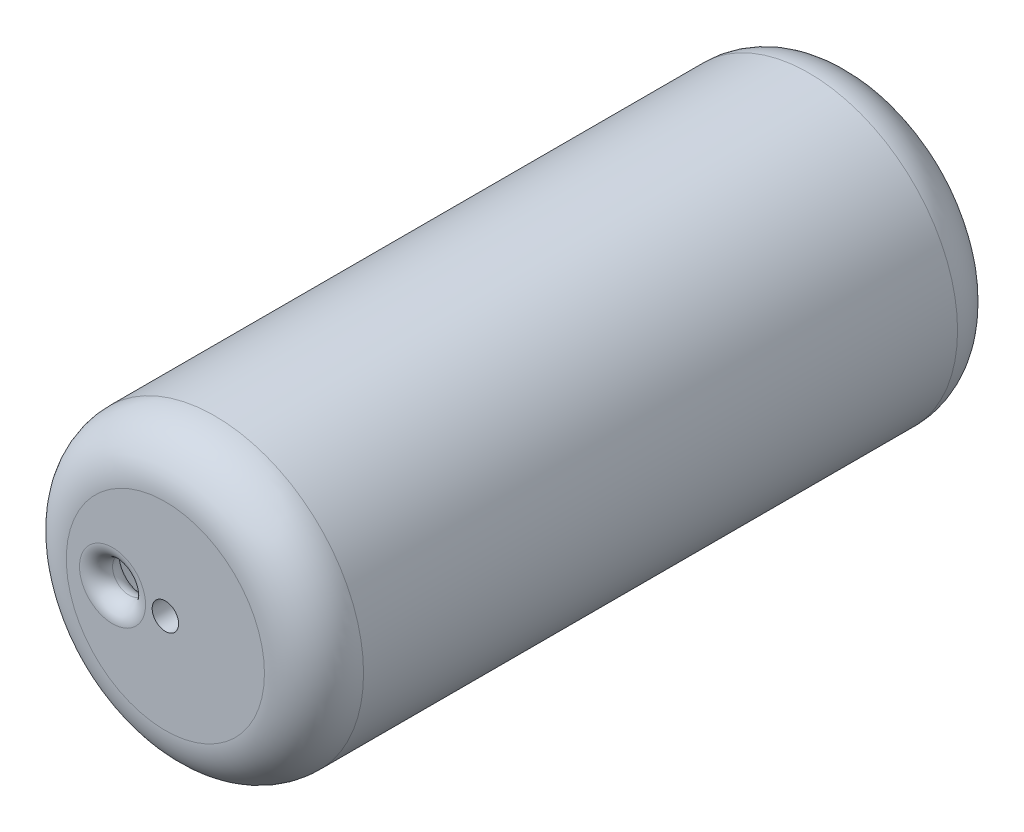
ISO-10303-21;
HEADER;
FILE_DESCRIPTION(('STEP AP214'),'2;1');
FILE_NAME('part.step','',(''),(''),'','','');
FILE_SCHEMA(('AUTOMOTIVE_DESIGN { 1 0 10303 214 1 1 1 1 }'));
ENDSEC;
DATA;
#1=APPLICATION_CONTEXT('core data for automotive mechanical design processes');
#2=APPLICATION_PROTOCOL_DEFINITION('international standard','automotive_design',2000,#1);
#3=PRODUCT_CONTEXT('',#1,'mechanical');
#4=PRODUCT('Part','Part','',(#3));
#5=PRODUCT_RELATED_PRODUCT_CATEGORY('part','',(#4));
#6=PRODUCT_DEFINITION_FORMATION('','',#4);
#7=PRODUCT_DEFINITION_CONTEXT('part definition',#1,'design');
#8=PRODUCT_DEFINITION('design','',#6,#7);
#9=PRODUCT_DEFINITION_SHAPE('','',#8);
#10=(LENGTH_UNIT() NAMED_UNIT(*) SI_UNIT(.MILLI.,.METRE.));
#11=(NAMED_UNIT(*) PLANE_ANGLE_UNIT() SI_UNIT($,.RADIAN.));
#12=(NAMED_UNIT(*) SI_UNIT($,.STERADIAN.) SOLID_ANGLE_UNIT());
#13=UNCERTAINTY_MEASURE_WITH_UNIT(LENGTH_MEASURE(1.E-05),#10,'distance_accuracy_value','');
#14=(GEOMETRIC_REPRESENTATION_CONTEXT(3) GLOBAL_UNCERTAINTY_ASSIGNED_CONTEXT((#13)) GLOBAL_UNIT_ASSIGNED_CONTEXT((#10,
#11,#12)) REPRESENTATION_CONTEXT('',''));
#15=CARTESIAN_POINT('',(0.,0.,0.));
#16=DIRECTION('',(0.,0.,1.));
#17=DIRECTION('',(1.,0.,0.));
#18=AXIS2_PLACEMENT_3D('',#15,#16,#17);
#19=CARTESIAN_POINT('',(0.,0.,3.175));
#20=DIRECTION('',(0.,0.,1.));
#21=DIRECTION('',(1.,0.,0.));
#22=AXIS2_PLACEMENT_3D('',#19,#20,#21);
#23=PLANE('',#22);
#24=CARTESIAN_POINT('',(-5.08,0.,3.175));
#25=DIRECTION('',(0.,0.,1.));
#26=DIRECTION('',(1.,0.,0.));
#27=AXIS2_PLACEMENT_3D('',#24,#25,#26);
#28=CIRCLE('',#27,3.175);
#29=CARTESIAN_POINT('',(-1.905,0.,3.175));
#30=VERTEX_POINT('',#29);
#31=EDGE_CURVE('E10',#30,#30,#28,.F.);
#32=ORIENTED_EDGE('',*,*,#31,.T.);
#33=EDGE_LOOP('',(#32));
#34=FACE_BOUND('',#33,.T.);
#35=CARTESIAN_POINT('',(0.,0.,3.175));
#36=DIRECTION('',(0.,0.,1.));
#37=DIRECTION('',(1.,0.,0.));
#38=AXIS2_PLACEMENT_3D('',#35,#36,#37);
#39=CIRCLE('',#38,1.27);
#40=CARTESIAN_POINT('',(1.27,0.,3.175));
#41=VERTEX_POINT('',#40);
#42=EDGE_CURVE('E129',#41,#41,#39,.T.);
#43=ORIENTED_EDGE('',*,*,#42,.F.);
#44=EDGE_LOOP('',(#43));
#45=FACE_BOUND('',#44,.T.);
#46=CARTESIAN_POINT('',(0.,0.,3.175));
#47=DIRECTION('',(0.,0.,1.));
#48=DIRECTION('',(1.,0.,0.));
#49=AXIS2_PLACEMENT_3D('',#46,#47,#48);
#50=CIRCLE('',#49,11.7475);
#51=CARTESIAN_POINT('',(11.7475,0.,3.175));
#52=VERTEX_POINT('',#51);
#53=EDGE_CURVE('E125',#52,#52,#50,.F.);
#54=ORIENTED_EDGE('',*,*,#53,.F.);
#55=EDGE_LOOP('',(#54));
#56=FACE_BOUND('',#55,.T.);
#57=ADVANCED_FACE('F31',(#34,#45,#56),#23,.T.);
#58=CARTESIAN_POINT('',(0.,0.,63.4492));
#59=DIRECTION('',(0.,0.,-1.));
#60=DIRECTION('',(-1.,0.,0.));
#61=AXIS2_PLACEMENT_3D('',#58,#59,#60);
#62=CYLINDRICAL_SURFACE('',#61,11.7475);
#63=CARTESIAN_POINT('',(0.,0.,63.4492));
#64=DIRECTION('',(0.,0.,1.));
#65=DIRECTION('',(1.,0.,0.));
#66=AXIS2_PLACEMENT_3D('',#63,#64,#65);
#67=CIRCLE('',#66,11.7475);
#68=CARTESIAN_POINT('',(11.7475,0.,63.4492));
#69=VERTEX_POINT('',#68);
#70=EDGE_CURVE('E132',#69,#69,#67,.T.);
#71=ORIENTED_EDGE('',*,*,#70,.T.);
#72=EDGE_LOOP('',(#71));
#73=FACE_BOUND('',#72,.T.);
#74=ORIENTED_EDGE('',*,*,#53,.T.);
#75=EDGE_LOOP('',(#74));
#76=FACE_BOUND('',#75,.T.);
#77=ADVANCED_FACE('F72',(#73,#76),#62,.F.);
#78=CARTESIAN_POINT('',(0.,0.,63.4492));
#79=DIRECTION('',(0.,0.,1.));
#80=DIRECTION('',(1.,0.,0.));
#81=AXIS2_PLACEMENT_3D('',#78,#79,#80);
#82=PLANE('',#81);
#83=CARTESIAN_POINT('',(-5.08,0.,63.4492));
#84=DIRECTION('',(0.,0.,1.));
#85=DIRECTION('',(1.,0.,0.));
#86=AXIS2_PLACEMENT_3D('',#83,#84,#85);
#87=CIRCLE('',#86,3.175);
#88=CARTESIAN_POINT('',(-1.905,0.,63.4492));
#89=VERTEX_POINT('',#88);
#90=EDGE_CURVE('E44',#89,#89,#87,.T.);
#91=ORIENTED_EDGE('',*,*,#90,.T.);
#92=EDGE_LOOP('',(#91));
#93=FACE_BOUND('',#92,.T.);
#94=CARTESIAN_POINT('',(0.,0.,63.4492));
#95=DIRECTION('',(0.,0.,1.));
#96=DIRECTION('',(1.,0.,0.));
#97=AXIS2_PLACEMENT_3D('',#94,#95,#96);
#98=CIRCLE('',#97,1.27);
#99=CARTESIAN_POINT('',(1.27,0.,63.4492));
#100=VERTEX_POINT('',#99);
#101=EDGE_CURVE('E126',#100,#100,#98,.T.);
#102=ORIENTED_EDGE('',*,*,#101,.T.);
#103=EDGE_LOOP('',(#102));
#104=FACE_BOUND('',#103,.T.);
#105=ORIENTED_EDGE('',*,*,#70,.F.);
#106=EDGE_LOOP('',(#105));
#107=FACE_BOUND('',#106,.T.);
#108=ADVANCED_FACE('F77',(#93,#104,#107),#82,.F.);
#109=CARTESIAN_POINT('',(0.,0.,0.));
#110=DIRECTION('',(0.,0.,1.));
#111=DIRECTION('',(1.,0.,0.));
#112=AXIS2_PLACEMENT_3D('',#109,#110,#111);
#113=CYLINDRICAL_SURFACE('',#112,1.27);
#114=CARTESIAN_POINT('',(0.,0.,66.6242));
#115=DIRECTION('',(0.,0.,1.));
#116=DIRECTION('',(1.,0.,0.));
#117=AXIS2_PLACEMENT_3D('',#114,#115,#116);
#118=CIRCLE('',#117,1.27);
#119=CARTESIAN_POINT('',(1.27,0.,66.6242));
#120=VERTEX_POINT('',#119);
#121=EDGE_CURVE('E49',#120,#120,#118,.T.);
#122=ORIENTED_EDGE('',*,*,#121,.T.);
#123=EDGE_LOOP('',(#122));
#124=FACE_BOUND('',#123,.T.);
#125=ORIENTED_EDGE('',*,*,#101,.F.);
#126=EDGE_LOOP('',(#125));
#127=FACE_BOUND('',#126,.T.);
#128=ADVANCED_FACE('F142',(#124,#127),#113,.F.);
#129=ORIENTED_EDGE('',*,*,#42,.T.);
#130=EDGE_LOOP('',(#129));
#131=FACE_BOUND('',#130,.T.);
#132=CARTESIAN_POINT('',(0.,0.,0.));
#133=DIRECTION('',(0.,0.,1.));
#134=DIRECTION('',(1.,0.,0.));
#135=AXIS2_PLACEMENT_3D('',#132,#133,#134);
#136=CIRCLE('',#135,1.27);
#137=CARTESIAN_POINT('',(1.27,0.,0.));
#138=VERTEX_POINT('',#137);
#139=EDGE_CURVE('E53',#138,#138,#136,.T.);
#140=ORIENTED_EDGE('',*,*,#139,.F.);
#141=EDGE_LOOP('',(#140));
#142=FACE_BOUND('',#141,.T.);
#143=ADVANCED_FACE('F91',(#131,#142),#113,.F.);
#144=CARTESIAN_POINT('',(0.,0.,3.175));
#145=DIRECTION('',(0.,0.,-1.));
#146=DIRECTION('',(-1.,0.,0.));
#147=AXIS2_PLACEMENT_3D('',#144,#145,#146);
#148=CYLINDRICAL_SURFACE('',#147,14.2875);
#149=CARTESIAN_POINT('',(0.,0.,4.7625));
#150=DIRECTION('',(0.,0.,1.));
#151=DIRECTION('',(1.,0.,0.));
#152=AXIS2_PLACEMENT_3D('',#149,#150,#151);
#153=CIRCLE('',#152,14.2875);
#154=CARTESIAN_POINT('',(14.2875,0.,4.7625));
#155=VERTEX_POINT('',#154);
#156=EDGE_CURVE('E119',#155,#155,#153,.T.);
#157=ORIENTED_EDGE('',*,*,#156,.T.);
#158=EDGE_LOOP('',(#157));
#159=FACE_BOUND('',#158,.T.);
#160=CARTESIAN_POINT('',(0.,0.,61.8617));
#161=DIRECTION('',(0.,0.,1.));
#162=DIRECTION('',(1.,0.,0.));
#163=AXIS2_PLACEMENT_3D('',#160,#161,#162);
#164=CIRCLE('',#163,14.2875);
#165=CARTESIAN_POINT('',(14.2875,0.,61.8617));
#166=VERTEX_POINT('',#165);
#167=EDGE_CURVE('E122',#166,#166,#164,.F.);
#168=ORIENTED_EDGE('',*,*,#167,.T.);
#169=EDGE_LOOP('',(#168));
#170=FACE_BOUND('',#169,.T.);
#171=ADVANCED_FACE('F87',(#159,#170),#148,.T.);
#172=CARTESIAN_POINT('',(0.,0.,0.));
#173=DIRECTION('',(0.,0.,1.));
#174=DIRECTION('',(1.,0.,0.));
#175=AXIS2_PLACEMENT_3D('',#172,#173,#174);
#176=PLANE('',#175);
#177=CARTESIAN_POINT('',(-5.08,0.,0.));
#178=DIRECTION('',(0.,0.,1.));
#179=DIRECTION('',(1.,0.,0.));
#180=AXIS2_PLACEMENT_3D('',#177,#178,#179);
#181=CIRCLE('',#180,3.175);
#182=CARTESIAN_POINT('',(-1.905,0.,0.));
#183=VERTEX_POINT('',#182);
#184=EDGE_CURVE('E39',#183,#183,#181,.T.);
#185=ORIENTED_EDGE('',*,*,#184,.T.);
#186=EDGE_LOOP('',(#185));
#187=FACE_BOUND('',#186,.T.);
#188=CARTESIAN_POINT('',(0.,0.,0.));
#189=DIRECTION('',(0.,0.,1.));
#190=DIRECTION('',(1.,0.,0.));
#191=AXIS2_PLACEMENT_3D('',#188,#189,#190);
#192=CIRCLE('',#191,9.525);
#193=CARTESIAN_POINT('',(9.525,0.,0.));
#194=VERTEX_POINT('',#193);
#195=EDGE_CURVE('E116',#194,#194,#192,.F.);
#196=ORIENTED_EDGE('',*,*,#195,.T.);
#197=EDGE_LOOP('',(#196));
#198=FACE_BOUND('',#197,.T.);
#199=ORIENTED_EDGE('',*,*,#139,.T.);
#200=EDGE_LOOP('',(#199));
#201=FACE_BOUND('',#200,.T.);
#202=ADVANCED_FACE('F83',(#187,#198,#201),#176,.F.);
#203=CARTESIAN_POINT('',(0.,0.,66.6242));
#204=DIRECTION('',(0.,0.,1.));
#205=DIRECTION('',(1.,0.,0.));
#206=AXIS2_PLACEMENT_3D('',#203,#204,#205);
#207=PLANE('',#206);
#208=CARTESIAN_POINT('',(-5.08,0.,66.6242));
#209=DIRECTION('',(0.,0.,1.));
#210=DIRECTION('',(1.,0.,0.));
#211=AXIS2_PLACEMENT_3D('',#208,#209,#210);
#212=CIRCLE('',#211,3.175);
#213=CARTESIAN_POINT('',(-1.905,0.,66.6242));
#214=VERTEX_POINT('',#213);
#215=EDGE_CURVE('E109',#214,#214,#212,.F.);
#216=ORIENTED_EDGE('',*,*,#215,.T.);
#217=EDGE_LOOP('',(#216));
#218=FACE_BOUND('',#217,.T.);
#219=CARTESIAN_POINT('',(0.,0.,66.6242));
#220=DIRECTION('',(0.,0.,1.));
#221=DIRECTION('',(1.,0.,0.));
#222=AXIS2_PLACEMENT_3D('',#219,#220,#221);
#223=CIRCLE('',#222,9.525);
#224=CARTESIAN_POINT('',(9.525,0.,66.6242));
#225=VERTEX_POINT('',#224);
#226=EDGE_CURVE('E111',#225,#225,#223,.T.);
#227=ORIENTED_EDGE('',*,*,#226,.T.);
#228=EDGE_LOOP('',(#227));
#229=FACE_BOUND('',#228,.T.);
#230=ORIENTED_EDGE('',*,*,#121,.F.);
#231=EDGE_LOOP('',(#230));
#232=FACE_BOUND('',#231,.T.);
#233=ADVANCED_FACE('F86',(#218,#229,#232),#207,.T.);
#234=CARTESIAN_POINT('',(0.,0.,4.7625));
#235=DIRECTION('',(0.,0.,1.));
#236=DIRECTION('',(1.,0.,0.));
#237=AXIS2_PLACEMENT_3D('',#234,#235,#236);
#238=TOROIDAL_SURFACE('',#237,9.525,4.7625);
#239=ORIENTED_EDGE('',*,*,#195,.F.);
#240=EDGE_LOOP('',(#239));
#241=FACE_BOUND('',#240,.T.);
#242=ORIENTED_EDGE('',*,*,#156,.F.);
#243=EDGE_LOOP('',(#242));
#244=FACE_BOUND('',#243,.T.);
#245=ADVANCED_FACE('F93',(#241,#244),#238,.T.);
#246=CARTESIAN_POINT('',(0.,0.,61.8617));
#247=DIRECTION('',(0.,0.,1.));
#248=DIRECTION('',(1.,0.,0.));
#249=AXIS2_PLACEMENT_3D('',#246,#247,#248);
#250=TOROIDAL_SURFACE('',#249,9.525,4.7625);
#251=ORIENTED_EDGE('',*,*,#167,.F.);
#252=EDGE_LOOP('',(#251));
#253=FACE_BOUND('',#252,.T.);
#254=ORIENTED_EDGE('',*,*,#226,.F.);
#255=EDGE_LOOP('',(#254));
#256=FACE_BOUND('',#255,.T.);
#257=ADVANCED_FACE('F96',(#253,#256),#250,.T.);
#258=CARTESIAN_POINT('',(-5.08,0.,65.0367));
#259=DIRECTION('',(0.,0.,1.));
#260=DIRECTION('',(1.,0.,0.));
#261=AXIS2_PLACEMENT_3D('',#258,#259,#260);
#262=TOROIDAL_SURFACE('',#261,3.175,1.5875);
#263=ORIENTED_EDGE('',*,*,#90,.F.);
#264=EDGE_LOOP('',(#263));
#265=FACE_BOUND('',#264,.T.);
#266=CARTESIAN_POINT('',(-5.08,0.,65.0367));
#267=DIRECTION('',(0.,0.,1.));
#268=DIRECTION('',(1.,0.,0.));
#269=AXIS2_PLACEMENT_3D('',#266,#267,#268);
#270=CIRCLE('',#269,1.5875);
#271=CARTESIAN_POINT('',(-3.4925,0.,65.0367));
#272=VERTEX_POINT('',#271);
#273=EDGE_CURVE('E47',#272,#272,#270,.F.);
#274=ORIENTED_EDGE('',*,*,#273,.F.);
#275=EDGE_LOOP('',(#274));
#276=FACE_BOUND('',#275,.T.);
#277=ADVANCED_FACE('F68',(#265,#276),#262,.T.);
#278=CARTESIAN_POINT('',(-5.08,0.,65.0367));
#279=DIRECTION('',(0.,0.,1.));
#280=DIRECTION('',(1.,0.,0.));
#281=AXIS2_PLACEMENT_3D('',#278,#279,#280);
#282=TOROIDAL_SURFACE('',#281,3.175,1.5875);
#283=ORIENTED_EDGE('',*,*,#215,.F.);
#284=EDGE_LOOP('',(#283));
#285=FACE_BOUND('',#284,.T.);
#286=ORIENTED_EDGE('',*,*,#273,.T.);
#287=EDGE_LOOP('',(#286));
#288=FACE_BOUND('',#287,.T.);
#289=ADVANCED_FACE('F62',(#285,#288),#282,.T.);
#290=CARTESIAN_POINT('',(-5.08,0.,1.5875));
#291=DIRECTION('',(0.,0.,1.));
#292=DIRECTION('',(1.,0.,0.));
#293=AXIS2_PLACEMENT_3D('',#290,#291,#292);
#294=TOROIDAL_SURFACE('',#293,3.175,1.5875);
#295=ORIENTED_EDGE('',*,*,#31,.F.);
#296=EDGE_LOOP('',(#295));
#297=FACE_BOUND('',#296,.T.);
#298=CARTESIAN_POINT('',(-5.08,0.,1.5875));
#299=DIRECTION('',(0.,0.,1.));
#300=DIRECTION('',(1.,0.,0.));
#301=AXIS2_PLACEMENT_3D('',#298,#299,#300);
#302=CIRCLE('',#301,1.5875);
#303=CARTESIAN_POINT('',(-3.4925,0.,1.5875));
#304=VERTEX_POINT('',#303);
#305=EDGE_CURVE('E35',#304,#304,#302,.T.);
#306=ORIENTED_EDGE('',*,*,#305,.F.);
#307=EDGE_LOOP('',(#306));
#308=FACE_BOUND('',#307,.T.);
#309=ADVANCED_FACE('F33',(#297,#308),#294,.T.);
#310=CARTESIAN_POINT('',(-5.08,0.,1.5875));
#311=DIRECTION('',(0.,0.,1.));
#312=DIRECTION('',(1.,0.,0.));
#313=AXIS2_PLACEMENT_3D('',#310,#311,#312);
#314=TOROIDAL_SURFACE('',#313,3.175,1.5875);
#315=ORIENTED_EDGE('',*,*,#305,.T.);
#316=EDGE_LOOP('',(#315));
#317=FACE_BOUND('',#316,.T.);
#318=ORIENTED_EDGE('',*,*,#184,.F.);
#319=EDGE_LOOP('',(#318));
#320=FACE_BOUND('',#319,.T.);
#321=ADVANCED_FACE('F58',(#317,#320),#314,.T.);
#322=CLOSED_SHELL('',(#57,#77,#108,#128,#143,#171,#202,#233,#245,#257,#277,#289,#309,#321));
#323=MANIFOLD_SOLID_BREP('B2',#322);
#324=ADVANCED_BREP_SHAPE_REPRESENTATION('',(#18,#323),#14);
#325=SHAPE_DEFINITION_REPRESENTATION(#9,#324);
ENDSEC;
END-ISO-10303-21;
